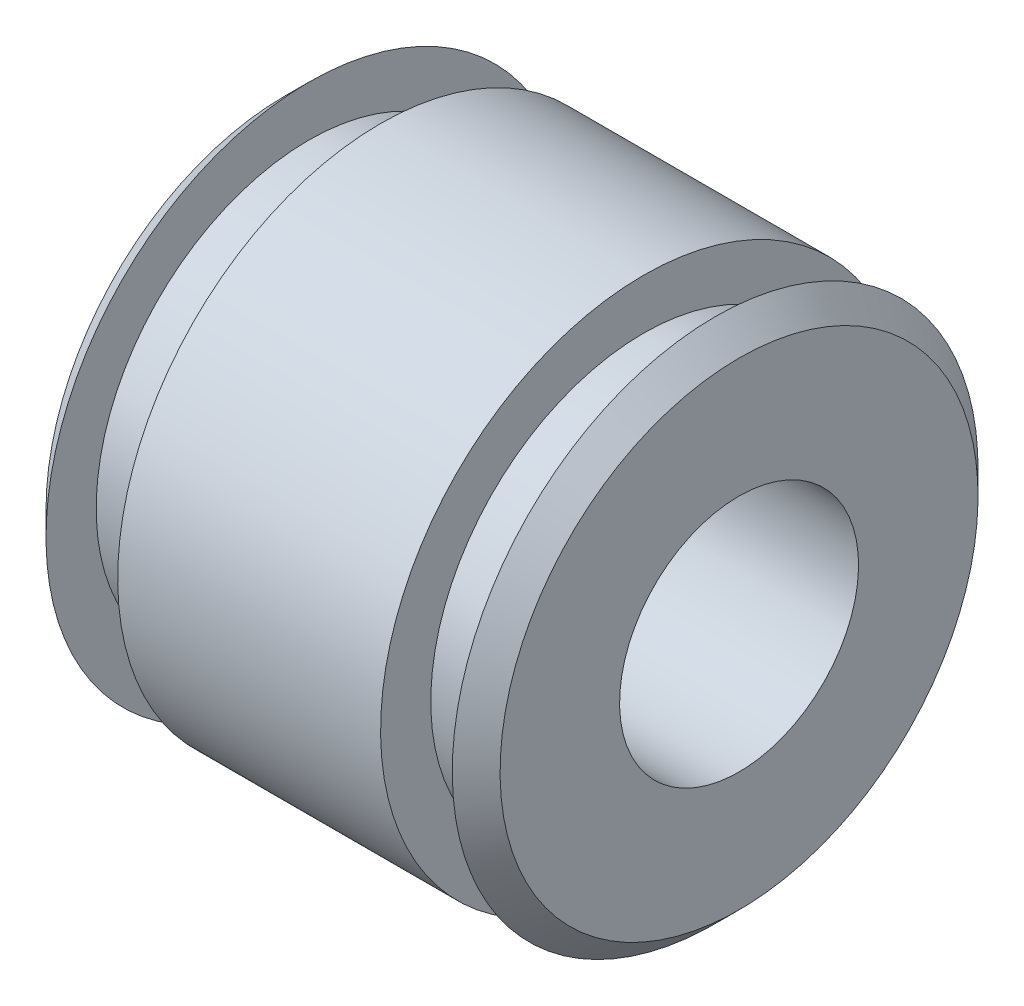
ISO-10303-21;
HEADER;
FILE_DESCRIPTION(('STEP AP214'),'2;1');
FILE_NAME('part.step','',(''),(''),'','','');
FILE_SCHEMA(('AUTOMOTIVE_DESIGN { 1 0 10303 214 1 1 1 1 }'));
ENDSEC;
DATA;
#1=APPLICATION_CONTEXT('core data for automotive mechanical design processes');
#2=APPLICATION_PROTOCOL_DEFINITION('international standard','automotive_design',2000,#1);
#3=PRODUCT_CONTEXT('',#1,'mechanical');
#4=PRODUCT('Part','Part','',(#3));
#5=PRODUCT_RELATED_PRODUCT_CATEGORY('part','',(#4));
#6=PRODUCT_DEFINITION_FORMATION('','',#4);
#7=PRODUCT_DEFINITION_CONTEXT('part definition',#1,'design');
#8=PRODUCT_DEFINITION('design','',#6,#7);
#9=PRODUCT_DEFINITION_SHAPE('','',#8);
#10=(LENGTH_UNIT() NAMED_UNIT(*) SI_UNIT(.MILLI.,.METRE.));
#11=(NAMED_UNIT(*) PLANE_ANGLE_UNIT() SI_UNIT($,.RADIAN.));
#12=(NAMED_UNIT(*) SI_UNIT($,.STERADIAN.) SOLID_ANGLE_UNIT());
#13=UNCERTAINTY_MEASURE_WITH_UNIT(LENGTH_MEASURE(1.E-05),#10,'distance_accuracy_value','');
#14=(GEOMETRIC_REPRESENTATION_CONTEXT(3) GLOBAL_UNCERTAINTY_ASSIGNED_CONTEXT((#13)) GLOBAL_UNIT_ASSIGNED_CONTEXT((#10,
#11,#12)) REPRESENTATION_CONTEXT('',''));
#15=CARTESIAN_POINT('',(0.,0.,0.));
#16=DIRECTION('',(0.,0.,1.));
#17=DIRECTION('',(1.,0.,0.));
#18=AXIS2_PLACEMENT_3D('',#15,#16,#17);
#19=CARTESIAN_POINT('',(0.,0.,0.));
#20=DIRECTION('',(-1.,0.,0.));
#21=DIRECTION('',(0.,-1.,0.));
#22=AXIS2_PLACEMENT_3D('',#19,#20,#21);
#23=PLANE('',#22);
#24=CARTESIAN_POINT('',(0.,0.,0.));
#25=DIRECTION('',(-1.,0.,0.));
#26=DIRECTION('',(0.,-1.,0.));
#27=AXIS2_PLACEMENT_3D('',#24,#25,#26);
#28=CIRCLE('',#27,9.99999999999999);
#29=CARTESIAN_POINT('',(0.,-9.99999999999999,0.));
#30=VERTEX_POINT('',#29);
#31=EDGE_CURVE('E10',#30,#30,#28,.T.);
#32=ORIENTED_EDGE('',*,*,#31,.T.);
#33=EDGE_LOOP('',(#32));
#34=FACE_BOUND('',#33,.T.);
#35=ADVANCED_FACE('F37',(#34),#23,.T.);
#36=CARTESIAN_POINT('',(1.,11.,0.));
#37=DIRECTION('',(1.,0.,0.));
#38=DIRECTION('',(0.,1.,0.));
#39=AXIS2_PLACEMENT_3D('',#36,#37,#38);
#40=PLANE('',#39);
#41=CARTESIAN_POINT('',(1.,0.,0.));
#42=DIRECTION('',(1.,0.,0.));
#43=DIRECTION('',(0.,1.,0.));
#44=AXIS2_PLACEMENT_3D('',#41,#42,#43);
#45=CIRCLE('',#44,11.);
#46=CARTESIAN_POINT('',(1.,11.,0.));
#47=VERTEX_POINT('',#46);
#48=EDGE_CURVE('E49',#47,#47,#45,.T.);
#49=ORIENTED_EDGE('',*,*,#48,.T.);
#50=EDGE_LOOP('',(#49));
#51=FACE_BOUND('',#50,.T.);
#52=CARTESIAN_POINT('',(1.,0.,0.));
#53=DIRECTION('',(1.,0.,0.));
#54=DIRECTION('',(0.,1.,0.));
#55=AXIS2_PLACEMENT_3D('',#52,#53,#54);
#56=CIRCLE('',#55,8.9);
#57=CARTESIAN_POINT('',(1.,8.9,0.));
#58=VERTEX_POINT('',#57);
#59=EDGE_CURVE('E53',#58,#58,#56,.T.);
#60=ORIENTED_EDGE('',*,*,#59,.F.);
#61=EDGE_LOOP('',(#60));
#62=FACE_BOUND('',#61,.T.);
#63=ADVANCED_FACE('F102',(#51,#62),#40,.T.);
#64=CARTESIAN_POINT('',(19.,0.,0.));
#65=DIRECTION('',(1.,0.,0.));
#66=DIRECTION('',(0.,1.,0.));
#67=AXIS2_PLACEMENT_3D('',#64,#65,#66);
#68=CYLINDRICAL_SURFACE('',#67,8.9);
#69=ORIENTED_EDGE('',*,*,#59,.T.);
#70=EDGE_LOOP('',(#69));
#71=FACE_BOUND('',#70,.T.);
#72=CARTESIAN_POINT('',(4.,0.,0.));
#73=DIRECTION('',(1.,0.,0.));
#74=DIRECTION('',(0.,1.,0.));
#75=AXIS2_PLACEMENT_3D('',#72,#73,#74);
#76=CIRCLE('',#75,8.9);
#77=CARTESIAN_POINT('',(4.,8.9,0.));
#78=VERTEX_POINT('',#77);
#79=EDGE_CURVE('E58',#78,#78,#76,.T.);
#80=ORIENTED_EDGE('',*,*,#79,.F.);
#81=EDGE_LOOP('',(#80));
#82=FACE_BOUND('',#81,.T.);
#83=ADVANCED_FACE('F107',(#71,#82),#68,.T.);
#84=CARTESIAN_POINT('',(4.,8.9,0.));
#85=DIRECTION('',(-1.,0.,0.));
#86=DIRECTION('',(0.,-1.,0.));
#87=AXIS2_PLACEMENT_3D('',#84,#85,#86);
#88=PLANE('',#87);
#89=ORIENTED_EDGE('',*,*,#79,.T.);
#90=EDGE_LOOP('',(#89));
#91=FACE_BOUND('',#90,.T.);
#92=CARTESIAN_POINT('',(4.,0.,0.));
#93=DIRECTION('',(1.,0.,0.));
#94=DIRECTION('',(0.,1.,0.));
#95=AXIS2_PLACEMENT_3D('',#92,#93,#94);
#96=CIRCLE('',#95,11.);
#97=CARTESIAN_POINT('',(4.,11.,0.));
#98=VERTEX_POINT('',#97);
#99=EDGE_CURVE('E61',#98,#98,#96,.T.);
#100=ORIENTED_EDGE('',*,*,#99,.F.);
#101=EDGE_LOOP('',(#100));
#102=FACE_BOUND('',#101,.T.);
#103=ADVANCED_FACE('F168',(#91,#102),#88,.T.);
#104=CARTESIAN_POINT('',(19.,0.,0.));
#105=DIRECTION('',(1.,0.,0.));
#106=DIRECTION('',(0.,1.,0.));
#107=AXIS2_PLACEMENT_3D('',#104,#105,#106);
#108=CYLINDRICAL_SURFACE('',#107,11.);
#109=ORIENTED_EDGE('',*,*,#99,.T.);
#110=EDGE_LOOP('',(#109));
#111=FACE_BOUND('',#110,.T.);
#112=CARTESIAN_POINT('',(15.,0.,0.));
#113=DIRECTION('',(1.,0.,0.));
#114=DIRECTION('',(0.,1.,0.));
#115=AXIS2_PLACEMENT_3D('',#112,#113,#114);
#116=CIRCLE('',#115,11.);
#117=CARTESIAN_POINT('',(15.,11.,0.));
#118=VERTEX_POINT('',#117);
#119=EDGE_CURVE('E64',#118,#118,#116,.T.);
#120=ORIENTED_EDGE('',*,*,#119,.F.);
#121=EDGE_LOOP('',(#120));
#122=FACE_BOUND('',#121,.T.);
#123=ADVANCED_FACE('F158',(#111,#122),#108,.T.);
#124=CARTESIAN_POINT('',(15.,11.,0.));
#125=DIRECTION('',(1.,0.,0.));
#126=DIRECTION('',(0.,1.,0.));
#127=AXIS2_PLACEMENT_3D('',#124,#125,#126);
#128=PLANE('',#127);
#129=ORIENTED_EDGE('',*,*,#119,.T.);
#130=EDGE_LOOP('',(#129));
#131=FACE_BOUND('',#130,.T.);
#132=CARTESIAN_POINT('',(15.,0.,0.));
#133=DIRECTION('',(1.,0.,0.));
#134=DIRECTION('',(0.,1.,0.));
#135=AXIS2_PLACEMENT_3D('',#132,#133,#134);
#136=CIRCLE('',#135,8.9);
#137=CARTESIAN_POINT('',(15.,8.9,0.));
#138=VERTEX_POINT('',#137);
#139=EDGE_CURVE('E67',#138,#138,#136,.T.);
#140=ORIENTED_EDGE('',*,*,#139,.F.);
#141=EDGE_LOOP('',(#140));
#142=FACE_BOUND('',#141,.T.);
#143=ADVANCED_FACE('F148',(#131,#142),#128,.T.);
#144=CARTESIAN_POINT('',(19.,0.,0.));
#145=DIRECTION('',(1.,0.,0.));
#146=DIRECTION('',(0.,1.,0.));
#147=AXIS2_PLACEMENT_3D('',#144,#145,#146);
#148=CYLINDRICAL_SURFACE('',#147,8.9);
#149=ORIENTED_EDGE('',*,*,#139,.T.);
#150=EDGE_LOOP('',(#149));
#151=FACE_BOUND('',#150,.T.);
#152=CARTESIAN_POINT('',(18.,0.,0.));
#153=DIRECTION('',(1.,0.,0.));
#154=DIRECTION('',(0.,1.,0.));
#155=AXIS2_PLACEMENT_3D('',#152,#153,#154);
#156=CIRCLE('',#155,8.9);
#157=CARTESIAN_POINT('',(18.,8.9,0.));
#158=VERTEX_POINT('',#157);
#159=EDGE_CURVE('E70',#158,#158,#156,.T.);
#160=ORIENTED_EDGE('',*,*,#159,.F.);
#161=EDGE_LOOP('',(#160));
#162=FACE_BOUND('',#161,.T.);
#163=ADVANCED_FACE('F98',(#151,#162),#148,.T.);
#164=CARTESIAN_POINT('',(18.,8.9,0.));
#165=DIRECTION('',(-1.,0.,0.));
#166=DIRECTION('',(0.,-1.,0.));
#167=AXIS2_PLACEMENT_3D('',#164,#165,#166);
#168=PLANE('',#167);
#169=ORIENTED_EDGE('',*,*,#159,.T.);
#170=EDGE_LOOP('',(#169));
#171=FACE_BOUND('',#170,.T.);
#172=CARTESIAN_POINT('',(18.,0.,0.));
#173=DIRECTION('',(1.,0.,0.));
#174=DIRECTION('',(0.,1.,0.));
#175=AXIS2_PLACEMENT_3D('',#172,#173,#174);
#176=CIRCLE('',#175,11.);
#177=CARTESIAN_POINT('',(18.,11.,0.));
#178=VERTEX_POINT('',#177);
#179=EDGE_CURVE('E73',#178,#178,#176,.T.);
#180=ORIENTED_EDGE('',*,*,#179,.F.);
#181=EDGE_LOOP('',(#180));
#182=FACE_BOUND('',#181,.T.);
#183=ADVANCED_FACE('F93',(#171,#182),#168,.T.);
#184=CARTESIAN_POINT('',(19.,11.,0.));
#185=DIRECTION('',(1.,0.,0.));
#186=DIRECTION('',(0.,1.,0.));
#187=AXIS2_PLACEMENT_3D('',#184,#185,#186);
#188=PLANE('',#187);
#189=CARTESIAN_POINT('',(19.,0.,0.));
#190=DIRECTION('',(1.,0.,0.));
#191=DIRECTION('',(0.,1.,0.));
#192=AXIS2_PLACEMENT_3D('',#189,#190,#191);
#193=CIRCLE('',#192,10.);
#194=CARTESIAN_POINT('',(19.,10.,0.));
#195=VERTEX_POINT('',#194);
#196=EDGE_CURVE('E45',#195,#195,#193,.T.);
#197=ORIENTED_EDGE('',*,*,#196,.T.);
#198=EDGE_LOOP('',(#197));
#199=FACE_BOUND('',#198,.T.);
#200=CARTESIAN_POINT('',(19.,0.,0.));
#201=DIRECTION('',(1.,0.,0.));
#202=DIRECTION('',(0.,1.,0.));
#203=AXIS2_PLACEMENT_3D('',#200,#201,#202);
#204=CIRCLE('',#203,5.);
#205=CARTESIAN_POINT('',(19.,5.,0.));
#206=VERTEX_POINT('',#205);
#207=EDGE_CURVE('E77',#206,#206,#204,.T.);
#208=ORIENTED_EDGE('',*,*,#207,.F.);
#209=EDGE_LOOP('',(#208));
#210=FACE_BOUND('',#209,.T.);
#211=ADVANCED_FACE('F88',(#199,#210),#188,.T.);
#212=CARTESIAN_POINT('',(3.,0.,0.));
#213=DIRECTION('',(1.,0.,0.));
#214=DIRECTION('',(0.,1.,0.));
#215=AXIS2_PLACEMENT_3D('',#212,#213,#214);
#216=CYLINDRICAL_SURFACE('',#215,5.);
#217=CARTESIAN_POINT('',(3.,0.,0.));
#218=DIRECTION('',(1.,0.,0.));
#219=DIRECTION('',(0.,1.,0.));
#220=AXIS2_PLACEMENT_3D('',#217,#218,#219);
#221=CIRCLE('',#220,5.);
#222=CARTESIAN_POINT('',(3.,5.,0.));
#223=VERTEX_POINT('',#222);
#224=EDGE_CURVE('E76',#223,#223,#221,.T.);
#225=ORIENTED_EDGE('',*,*,#224,.F.);
#226=EDGE_LOOP('',(#225));
#227=FACE_BOUND('',#226,.T.);
#228=ORIENTED_EDGE('',*,*,#207,.T.);
#229=EDGE_LOOP('',(#228));
#230=FACE_BOUND('',#229,.T.);
#231=ADVANCED_FACE('F85',(#227,#230),#216,.F.);
#232=CARTESIAN_POINT('',(3.,0.,0.));
#233=DIRECTION('',(1.,0.,0.));
#234=DIRECTION('',(0.,1.,0.));
#235=AXIS2_PLACEMENT_3D('',#232,#233,#234);
#236=PLANE('',#235);
#237=ORIENTED_EDGE('',*,*,#224,.T.);
#238=EDGE_LOOP('',(#237));
#239=FACE_BOUND('',#238,.T.);
#240=ADVANCED_FACE('F83',(#239),#236,.T.);
#241=CARTESIAN_POINT('',(19.,0.,0.));
#242=DIRECTION('',(-1.,0.,0.));
#243=DIRECTION('',(0.,-1.,0.));
#244=AXIS2_PLACEMENT_3D('',#241,#242,#243);
#245=CONICAL_SURFACE('',#244,10.,0.785398163397444);
#246=ORIENTED_EDGE('',*,*,#179,.T.);
#247=EDGE_LOOP('',(#246));
#248=FACE_BOUND('',#247,.T.);
#249=ORIENTED_EDGE('',*,*,#196,.F.);
#250=EDGE_LOOP('',(#249));
#251=FACE_BOUND('',#250,.T.);
#252=ADVANCED_FACE('F112',(#248,#251),#245,.T.);
#253=CARTESIAN_POINT('',(1.,0.,0.));
#254=DIRECTION('',(1.,0.,0.));
#255=DIRECTION('',(0.,1.,0.));
#256=AXIS2_PLACEMENT_3D('',#253,#254,#255);
#257=CONICAL_SURFACE('',#256,11.,0.785398163397449);
#258=ORIENTED_EDGE('',*,*,#31,.F.);
#259=EDGE_LOOP('',(#258));
#260=FACE_BOUND('',#259,.T.);
#261=ORIENTED_EDGE('',*,*,#48,.F.);
#262=EDGE_LOOP('',(#261));
#263=FACE_BOUND('',#262,.T.);
#264=ADVANCED_FACE('F40',(#260,#263),#257,.T.);
#265=CLOSED_SHELL('',(#35,#63,#83,#103,#123,#143,#163,#183,#211,#231,#240,#252,#264));
#266=MANIFOLD_SOLID_BREP('B2',#265);
#267=ADVANCED_BREP_SHAPE_REPRESENTATION('',(#18,#266),#14);
#268=SHAPE_DEFINITION_REPRESENTATION(#9,#267);
ENDSEC;
END-ISO-10303-21;
